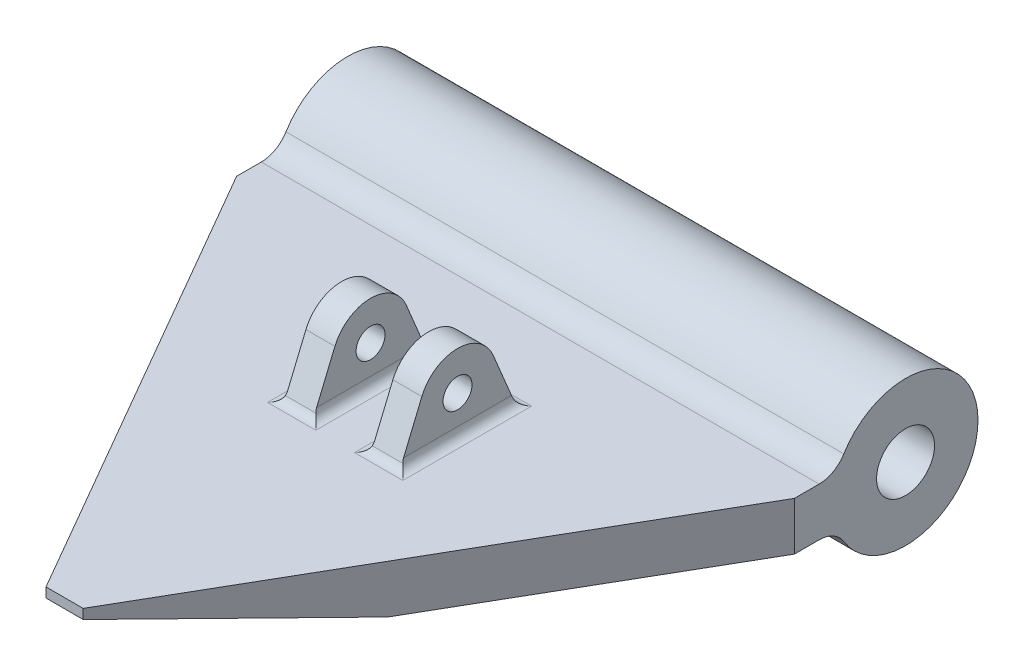
ISO-10303-21;
HEADER;
FILE_DESCRIPTION(('STEP AP214'),'2;1');
FILE_NAME('part.step','',(''),(''),'','','');
FILE_SCHEMA(('AUTOMOTIVE_DESIGN { 1 0 10303 214 1 1 1 1 }'));
ENDSEC;
DATA;
#1=APPLICATION_CONTEXT('core data for automotive mechanical design processes');
#2=APPLICATION_PROTOCOL_DEFINITION('international standard','automotive_design',2000,#1);
#3=PRODUCT_CONTEXT('',#1,'mechanical');
#4=PRODUCT('Part','Part','',(#3));
#5=PRODUCT_RELATED_PRODUCT_CATEGORY('part','',(#4));
#6=PRODUCT_DEFINITION_FORMATION('','',#4);
#7=PRODUCT_DEFINITION_CONTEXT('part definition',#1,'design');
#8=PRODUCT_DEFINITION('design','',#6,#7);
#9=PRODUCT_DEFINITION_SHAPE('','',#8);
#10=(LENGTH_UNIT() NAMED_UNIT(*) SI_UNIT(.MILLI.,.METRE.));
#11=(NAMED_UNIT(*) PLANE_ANGLE_UNIT() SI_UNIT($,.RADIAN.));
#12=(NAMED_UNIT(*) SI_UNIT($,.STERADIAN.) SOLID_ANGLE_UNIT());
#13=UNCERTAINTY_MEASURE_WITH_UNIT(LENGTH_MEASURE(1.E-05),#10,'distance_accuracy_value','');
#14=(GEOMETRIC_REPRESENTATION_CONTEXT(3) GLOBAL_UNCERTAINTY_ASSIGNED_CONTEXT((#13)) GLOBAL_UNIT_ASSIGNED_CONTEXT((#10,
#11,#12)) REPRESENTATION_CONTEXT('',''));
#15=CARTESIAN_POINT('',(0.,0.,0.));
#16=DIRECTION('',(0.,0.,1.));
#17=DIRECTION('',(1.,0.,0.));
#18=AXIS2_PLACEMENT_3D('',#15,#16,#17);
#19=CARTESIAN_POINT('',(0.,5.,0.));
#20=DIRECTION('',(0.,-1.,0.));
#21=DIRECTION('',(0.,0.,-1.));
#22=AXIS2_PLACEMENT_3D('',#19,#20,#21);
#23=PLANE('',#22);
#24=DIRECTION('',(0.,0.,-1.));
#25=VECTOR('',#24,1.);
#26=CARTESIAN_POINT('',(-7.,5.,0.));
#27=LINE('',#26,#25);
#28=CARTESIAN_POINT('',(-7.,5.,-32.3333333333334));
#29=VERTEX_POINT('',#28);
#30=CARTESIAN_POINT('',(-7.,5.,-45.6666666666667));
#31=VERTEX_POINT('',#30);
#32=EDGE_CURVE('E372',#29,#31,#27,.T.);
#33=ORIENTED_EDGE('',*,*,#32,.T.);
#34=DIRECTION('',(1.,0.,0.));
#35=VECTOR('',#34,1.);
#36=CARTESIAN_POINT('',(0.,5.,-45.6666666666667));
#37=LINE('',#36,#35);
#38=CARTESIAN_POINT('',(-2.,5.,-45.6666666666667));
#39=VERTEX_POINT('',#38);
#40=EDGE_CURVE('E378',#31,#39,#37,.T.);
#41=ORIENTED_EDGE('',*,*,#40,.T.);
#42=DIRECTION('',(0.,0.,-1.));
#43=VECTOR('',#42,1.);
#44=CARTESIAN_POINT('',(-2.,5.,-33.));
#45=LINE('',#44,#43);
#46=CARTESIAN_POINT('',(-2.,5.,-32.3333333333334));
#47=VERTEX_POINT('',#46);
#48=EDGE_CURVE('E376',#39,#47,#45,.F.);
#49=ORIENTED_EDGE('',*,*,#48,.T.);
#50=DIRECTION('',(1.,0.,0.));
#51=VECTOR('',#50,1.);
#52=CARTESIAN_POINT('',(0.,5.,-32.3333333333334));
#53=LINE('',#52,#51);
#54=EDGE_CURVE('E374',#47,#29,#53,.F.);
#55=ORIENTED_EDGE('',*,*,#54,.T.);
#56=EDGE_LOOP('',(#33,#41,#49,#55));
#57=FACE_BOUND('',#56,.T.);
#58=DIRECTION('',(0.,0.,-1.));
#59=VECTOR('',#58,1.);
#60=CARTESIAN_POINT('',(2.,5.,-45.));
#61=LINE('',#60,#59);
#62=CARTESIAN_POINT('',(2.,5.,-32.3333333333334));
#63=VERTEX_POINT('',#62);
#64=CARTESIAN_POINT('',(2.,5.,-45.6666666666667));
#65=VERTEX_POINT('',#64);
#66=EDGE_CURVE('E367',#63,#65,#61,.T.);
#67=ORIENTED_EDGE('',*,*,#66,.T.);
#68=DIRECTION('',(-1.,0.,0.));
#69=VECTOR('',#68,1.);
#70=CARTESIAN_POINT('',(6.,5.,-45.6666666666667));
#71=LINE('',#70,#69);
#72=CARTESIAN_POINT('',(7.,5.,-45.6666666666667));
#73=VERTEX_POINT('',#72);
#74=EDGE_CURVE('E369',#65,#73,#71,.F.);
#75=ORIENTED_EDGE('',*,*,#74,.T.);
#76=DIRECTION('',(0.,0.,-1.));
#77=VECTOR('',#76,1.);
#78=CARTESIAN_POINT('',(7.,5.,0.));
#79=LINE('',#78,#77);
#80=CARTESIAN_POINT('',(7.,5.,-32.3333333333334));
#81=VERTEX_POINT('',#80);
#82=EDGE_CURVE('E363',#73,#81,#79,.F.);
#83=ORIENTED_EDGE('',*,*,#82,.T.);
#84=DIRECTION('',(-1.,0.,0.));
#85=VECTOR('',#84,1.);
#86=CARTESIAN_POINT('',(3.,5.,-32.3333333333334));
#87=LINE('',#86,#85);
#88=EDGE_CURVE('E365',#81,#63,#87,.T.);
#89=ORIENTED_EDGE('',*,*,#88,.T.);
#90=EDGE_LOOP('',(#67,#75,#83,#89));
#91=FACE_BOUND('',#90,.T.);
#92=DIRECTION('',(0.5,0.,0.866025403784439));
#93=VECTOR('',#92,1.);
#94=CARTESIAN_POINT('',(-2.0669872981078,5.,-4.58012701892223));
#95=LINE('',#94,#93);
#96=CARTESIAN_POINT('',(-28.8675134594813,5.,-51.));
#97=VERTEX_POINT('',#96);
#98=CARTESIAN_POINT('',(-1.92264973081039,5.,-4.33012701892223));
#99=VERTEX_POINT('',#98);
#100=EDGE_CURVE('E290',#97,#99,#95,.T.);
#101=ORIENTED_EDGE('',*,*,#100,.T.);
#102=DIRECTION('',(-1.,0.,0.));
#103=VECTOR('',#102,1.);
#104=CARTESIAN_POINT('',(-2.49999999999998,5.,-4.33012701892223));
#105=LINE('',#104,#103);
#106=CARTESIAN_POINT('',(1.92264973081039,5.,-4.33012701892223));
#107=VERTEX_POINT('',#106);
#108=EDGE_CURVE('E301',#107,#99,#105,.T.);
#109=ORIENTED_EDGE('',*,*,#108,.F.);
#110=DIRECTION('',(-0.500000000000001,0.,0.866025403784438));
#111=VECTOR('',#110,1.);
#112=CARTESIAN_POINT('',(29.9741761850344,5.,-52.9167960675007));
#113=LINE('',#112,#111);
#114=CARTESIAN_POINT('',(28.8675134594813,5.,-51.));
#115=VERTEX_POINT('',#114);
#116=EDGE_CURVE('E297',#115,#107,#113,.T.);
#117=ORIENTED_EDGE('',*,*,#116,.F.);
#118=DIRECTION('',(0.,0.,-1.));
#119=VECTOR('',#118,1.);
#120=CARTESIAN_POINT('',(28.8675134594813,5.,-70.0000000000001));
#121=LINE('',#120,#119);
#122=CARTESIAN_POINT('',(28.8675134594813,5.,-53.5557280900009));
#123=VERTEX_POINT('',#122);
#124=EDGE_CURVE('E317',#115,#123,#121,.T.);
#125=ORIENTED_EDGE('',*,*,#124,.T.);
#126=DIRECTION('',(1.,0.,0.));
#127=VECTOR('',#126,1.);
#128=CARTESIAN_POINT('',(0.,5.,-53.5557280900009));
#129=LINE('',#128,#127);
#130=CARTESIAN_POINT('',(-28.8675134594813,5.,-53.5557280900008));
#131=VERTEX_POINT('',#130);
#132=EDGE_CURVE('E334',#123,#131,#129,.F.);
#133=ORIENTED_EDGE('',*,*,#132,.T.);
#134=DIRECTION('',(0.,0.,1.));
#135=VECTOR('',#134,1.);
#136=CARTESIAN_POINT('',(-28.8675134594813,5.,-50.));
#137=LINE('',#136,#135);
#138=EDGE_CURVE('E319',#131,#97,#137,.T.);
#139=ORIENTED_EDGE('',*,*,#138,.T.);
#140=EDGE_LOOP('',(#101,#109,#117,#125,#133,#139));
#141=FACE_BOUND('',#140,.T.);
#142=ADVANCED_FACE('F53',(#57,#91,#141),#23,.F.);
#143=CARTESIAN_POINT('',(0.,0.,0.));
#144=DIRECTION('',(0.,-1.,0.));
#145=DIRECTION('',(0.,0.,-1.));
#146=AXIS2_PLACEMENT_3D('',#143,#144,#145);
#147=PLANE('',#146);
#148=DIRECTION('',(0.5,0.,-0.866025403784439));
#149=VECTOR('',#148,1.);
#150=CARTESIAN_POINT('',(2.0669872981078,0.,-4.58012701892223));
#151=LINE('',#150,#149);
#152=CARTESIAN_POINT('',(13.4696551146031,0.,-24.3301270189226));
#153=VERTEX_POINT('',#152);
#154=CARTESIAN_POINT('',(28.8675134594813,0.,-51.));
#155=VERTEX_POINT('',#154);
#156=EDGE_CURVE('E295',#153,#155,#151,.T.);
#157=ORIENTED_EDGE('',*,*,#156,.F.);
#158=DIRECTION('',(-1.,0.,0.));
#159=VECTOR('',#158,1.);
#160=CARTESIAN_POINT('',(-1.92264973081039,0.,-24.3301270189226));
#161=LINE('',#160,#159);
#162=CARTESIAN_POINT('',(-13.4696551146031,0.,-24.3301270189226));
#163=VERTEX_POINT('',#162);
#164=EDGE_CURVE('E352',#153,#163,#161,.T.);
#165=ORIENTED_EDGE('',*,*,#164,.T.);
#166=DIRECTION('',(-0.5,0.,-0.866025403784439));
#167=VECTOR('',#166,1.);
#168=CARTESIAN_POINT('',(-2.0669872981078,0.,-4.58012701892223));
#169=LINE('',#168,#167);
#170=CARTESIAN_POINT('',(-28.8675134594813,0.,-51.));
#171=VERTEX_POINT('',#170);
#172=EDGE_CURVE('E288',#163,#171,#169,.T.);
#173=ORIENTED_EDGE('',*,*,#172,.T.);
#174=DIRECTION('',(0.,0.,1.));
#175=VECTOR('',#174,1.);
#176=CARTESIAN_POINT('',(-28.8675134594813,0.,-50.));
#177=LINE('',#176,#175);
#178=CARTESIAN_POINT('',(-28.8675134594813,0.,-53.5557280900008));
#179=VERTEX_POINT('',#178);
#180=EDGE_CURVE('E320',#179,#171,#177,.T.);
#181=ORIENTED_EDGE('',*,*,#180,.F.);
#182=DIRECTION('',(-1.,0.,0.));
#183=VECTOR('',#182,1.);
#184=CARTESIAN_POINT('',(28.8675134594812,0.,-53.5557280900009));
#185=LINE('',#184,#183);
#186=CARTESIAN_POINT('',(28.8675134594813,0.,-53.5557280900009));
#187=VERTEX_POINT('',#186);
#188=EDGE_CURVE('E331',#179,#187,#185,.F.);
#189=ORIENTED_EDGE('',*,*,#188,.T.);
#190=DIRECTION('',(0.,0.,-1.));
#191=VECTOR('',#190,1.);
#192=CARTESIAN_POINT('',(28.8675134594813,0.,-70.0000000000001));
#193=LINE('',#192,#191);
#194=EDGE_CURVE('E308',#155,#187,#193,.T.);
#195=ORIENTED_EDGE('',*,*,#194,.F.);
#196=EDGE_LOOP('',(#157,#165,#173,#181,#189,#195));
#197=FACE_BOUND('',#196,.T.);
#198=ADVANCED_FACE('F459',(#197),#147,.T.);
#199=CARTESIAN_POINT('',(-2.49999999999998,-6.6143782776615,-4.33012701892223));
#200=DIRECTION('',(0.,0.,-1.));
#201=DIRECTION('',(-1.,0.,0.));
#202=AXIS2_PLACEMENT_3D('',#199,#200,#201);
#203=PLANE('',#202);
#204=DIRECTION('',(0.,1.,0.));
#205=VECTOR('',#204,1.);
#206=CARTESIAN_POINT('',(-1.92264973081039,-6.6143782776615,-4.33012701892223));
#207=LINE('',#206,#205);
#208=CARTESIAN_POINT('',(-1.92264973081039,4.00000000000001,-4.33012701892223));
#209=VERTEX_POINT('',#208);
#210=EDGE_CURVE('E293',#209,#99,#207,.T.);
#211=ORIENTED_EDGE('',*,*,#210,.F.);
#212=DIRECTION('',(1.,0.,0.));
#213=VECTOR('',#212,1.);
#214=CARTESIAN_POINT('',(1.92264973081039,4.00000000000001,-4.33012701892223));
#215=LINE('',#214,#213);
#216=CARTESIAN_POINT('',(1.92264973081039,4.00000000000001,-4.33012701892223));
#217=VERTEX_POINT('',#216);
#218=EDGE_CURVE('E357',#209,#217,#215,.T.);
#219=ORIENTED_EDGE('',*,*,#218,.T.);
#220=DIRECTION('',(0.,-1.,0.));
#221=VECTOR('',#220,1.);
#222=CARTESIAN_POINT('',(1.92264973081039,-6.6143782776615,-4.33012701892223));
#223=LINE('',#222,#221);
#224=EDGE_CURVE('E346',#107,#217,#223,.T.);
#225=ORIENTED_EDGE('',*,*,#224,.F.);
#226=ORIENTED_EDGE('',*,*,#108,.T.);
#227=EDGE_LOOP('',(#211,#219,#225,#226));
#228=FACE_BOUND('',#227,.T.);
#229=ADVANCED_FACE('F464',(#228),#203,.F.);
#230=CARTESIAN_POINT('',(-28.8675134594813,5.,-50.));
#231=DIRECTION('',(1.,0.,0.));
#232=DIRECTION('',(0.,0.,-1.));
#233=AXIS2_PLACEMENT_3D('',#230,#231,#232);
#234=PLANE('',#233);
#235=CARTESIAN_POINT('',(-28.8675134594813,2.5,-62.5));
#236=DIRECTION('',(1.,0.,0.));
#237=DIRECTION('',(0.,0.,-1.));
#238=AXIS2_PLACEMENT_3D('',#235,#236,#237);
#239=CIRCLE('',#238,3.00000000000001);
#240=CARTESIAN_POINT('',(-28.8675134594813,2.5,-65.5));
#241=VERTEX_POINT('',#240);
#242=EDGE_CURVE('E309',#241,#241,#239,.F.);
#243=ORIENTED_EDGE('',*,*,#242,.F.);
#244=EDGE_LOOP('',(#243));
#245=FACE_BOUND('',#244,.T.);
#246=DIRECTION('',(0.,-1.,0.));
#247=VECTOR('',#246,1.);
#248=CARTESIAN_POINT('',(-28.8675134594813,5.,-51.));
#249=LINE('',#248,#247);
#250=EDGE_CURVE('E349',#97,#171,#249,.T.);
#251=ORIENTED_EDGE('',*,*,#250,.F.);
#252=ORIENTED_EDGE('',*,*,#138,.F.);
#253=CARTESIAN_POINT('',(-28.8675134594813,8.,-53.5557280900008));
#254=DIRECTION('',(1.,0.,0.));
#255=DIRECTION('',(0.,0.,-1.));
#256=AXIS2_PLACEMENT_3D('',#253,#254,#255);
#257=CIRCLE('',#256,3.);
#258=CARTESIAN_POINT('',(-28.8675134594813,6.42857142857145,-56.1112343500006));
#259=VERTEX_POINT('',#258);
#260=EDGE_CURVE('E341',#131,#259,#257,.T.);
#261=ORIENTED_EDGE('',*,*,#260,.T.);
#262=CARTESIAN_POINT('',(-28.8675134594813,2.5,-62.5));
#263=DIRECTION('',(1.,0.,0.));
#264=DIRECTION('',(0.,0.,-1.));
#265=AXIS2_PLACEMENT_3D('',#262,#263,#264);
#266=CIRCLE('',#265,7.50000000000001);
#267=CARTESIAN_POINT('',(-28.8675134594813,-1.42857142857145,-56.1112343500006));
#268=VERTEX_POINT('',#267);
#269=EDGE_CURVE('E305',#259,#268,#266,.F.);
#270=ORIENTED_EDGE('',*,*,#269,.T.);
#271=CARTESIAN_POINT('',(-28.8675134594813,-3.,-53.5557280900008));
#272=DIRECTION('',(1.,0.,0.));
#273=DIRECTION('',(0.,0.,-1.));
#274=AXIS2_PLACEMENT_3D('',#271,#272,#273);
#275=CIRCLE('',#274,3.);
#276=EDGE_CURVE('E337',#268,#179,#275,.T.);
#277=ORIENTED_EDGE('',*,*,#276,.T.);
#278=ORIENTED_EDGE('',*,*,#180,.T.);
#279=EDGE_LOOP('',(#251,#252,#261,#270,#277,#278));
#280=FACE_BOUND('',#279,.T.);
#281=ADVANCED_FACE('F471',(#245,#280),#234,.F.);
#282=CARTESIAN_POINT('',(28.8675134594813,5.,-70.0000000000001));
#283=DIRECTION('',(-1.,0.,0.));
#284=DIRECTION('',(0.,0.,1.));
#285=AXIS2_PLACEMENT_3D('',#282,#283,#284);
#286=PLANE('',#285);
#287=CARTESIAN_POINT('',(28.8675134594813,2.5,-62.5000000000001));
#288=DIRECTION('',(1.,0.,0.));
#289=DIRECTION('',(0.,0.,-1.));
#290=AXIS2_PLACEMENT_3D('',#287,#288,#289);
#291=CIRCLE('',#290,3.00000000000001);
#292=CARTESIAN_POINT('',(28.8675134594812,2.5,-65.5000000000001));
#293=VERTEX_POINT('',#292);
#294=EDGE_CURVE('E304',#293,#293,#291,.T.);
#295=ORIENTED_EDGE('',*,*,#294,.F.);
#296=EDGE_LOOP('',(#295));
#297=FACE_BOUND('',#296,.T.);
#298=DIRECTION('',(0.,1.,0.));
#299=VECTOR('',#298,1.);
#300=CARTESIAN_POINT('',(28.8675134594813,5.,-51.));
#301=LINE('',#300,#299);
#302=EDGE_CURVE('E299',#155,#115,#301,.T.);
#303=ORIENTED_EDGE('',*,*,#302,.F.);
#304=ORIENTED_EDGE('',*,*,#194,.T.);
#305=CARTESIAN_POINT('',(28.8675134594813,-3.,-53.5557280900009));
#306=DIRECTION('',(-1.,0.,0.));
#307=DIRECTION('',(0.,0.,1.));
#308=AXIS2_PLACEMENT_3D('',#305,#306,#307);
#309=CIRCLE('',#308,3.);
#310=CARTESIAN_POINT('',(28.8675134594813,-1.42857142857141,-56.1112343500006));
#311=VERTEX_POINT('',#310);
#312=EDGE_CURVE('E339',#187,#311,#309,.T.);
#313=ORIENTED_EDGE('',*,*,#312,.T.);
#314=CARTESIAN_POINT('',(28.8675134594813,2.5,-62.5000000000001));
#315=DIRECTION('',(1.,0.,0.));
#316=DIRECTION('',(0.,0.,-1.));
#317=AXIS2_PLACEMENT_3D('',#314,#315,#316);
#318=CIRCLE('',#317,7.50000000000001);
#319=CARTESIAN_POINT('',(28.8675134594813,6.42857142857141,-56.1112343500007));
#320=VERTEX_POINT('',#319);
#321=EDGE_CURVE('E312',#311,#320,#318,.T.);
#322=ORIENTED_EDGE('',*,*,#321,.T.);
#323=CARTESIAN_POINT('',(28.8675134594813,8.,-53.5557280900009));
#324=DIRECTION('',(-1.,0.,0.));
#325=DIRECTION('',(0.,0.,1.));
#326=AXIS2_PLACEMENT_3D('',#323,#324,#325);
#327=CIRCLE('',#326,3.);
#328=EDGE_CURVE('E343',#320,#123,#327,.T.);
#329=ORIENTED_EDGE('',*,*,#328,.T.);
#330=ORIENTED_EDGE('',*,*,#124,.F.);
#331=EDGE_LOOP('',(#303,#304,#313,#322,#329,#330));
#332=FACE_BOUND('',#331,.T.);
#333=ADVANCED_FACE('F474',(#297,#332),#286,.F.);
#334=CARTESIAN_POINT('',(-50.0807168950777,2.5,-62.5));
#335=DIRECTION('',(1.,0.,0.));
#336=DIRECTION('',(0.,0.,-1.));
#337=AXIS2_PLACEMENT_3D('',#334,#335,#336);
#338=CYLINDRICAL_SURFACE('',#337,7.50000000000001);
#339=ORIENTED_EDGE('',*,*,#321,.F.);
#340=DIRECTION('',(1.,0.,0.));
#341=VECTOR('',#340,1.);
#342=CARTESIAN_POINT('',(-50.0807168950777,-1.42857142857143,-56.1112343500005));
#343=LINE('',#342,#341);
#344=EDGE_CURVE('E328',#311,#268,#343,.F.);
#345=ORIENTED_EDGE('',*,*,#344,.T.);
#346=ORIENTED_EDGE('',*,*,#269,.F.);
#347=DIRECTION('',(1.,0.,0.));
#348=VECTOR('',#347,1.);
#349=CARTESIAN_POINT('',(-50.0807168950777,6.42857142857143,-56.1112343500005));
#350=LINE('',#349,#348);
#351=EDGE_CURVE('E323',#259,#320,#350,.T.);
#352=ORIENTED_EDGE('',*,*,#351,.T.);
#353=EDGE_LOOP('',(#339,#345,#346,#352));
#354=FACE_BOUND('',#353,.T.);
#355=ADVANCED_FACE('F468',(#354),#338,.T.);
#356=CARTESIAN_POINT('',(-50.0807168950777,2.5,-62.5));
#357=DIRECTION('',(1.,0.,0.));
#358=DIRECTION('',(0.,0.,-1.));
#359=AXIS2_PLACEMENT_3D('',#356,#357,#358);
#360=CYLINDRICAL_SURFACE('',#359,3.00000000000001);
#361=CARTESIAN_POINT('',(28.8675134594812,2.5,-65.5000000000001));
#362=CARTESIAN_POINT('',(28.2661069290754,2.5,-65.5000000000001));
#363=CARTESIAN_POINT('',(27.6647003986695,2.5,-65.5000000000001));
#364=CARTESIAN_POINT('',(26.4618873378578,2.5,-65.5000000000001));
#365=CARTESIAN_POINT('',(25.8604808074519,2.5,-65.5000000000001));
#366=CARTESIAN_POINT('',(24.6576677466402,2.5,-65.5000000000001));
#367=CARTESIAN_POINT('',(24.0562612162344,2.5,-65.5000000000001));
#368=CARTESIAN_POINT('',(22.8534481554226,2.5,-65.5000000000001));
#369=CARTESIAN_POINT('',(22.2520416250168,2.5,-65.5000000000001));
#370=CARTESIAN_POINT('',(21.0492285642051,2.5,-65.5000000000001));
#371=CARTESIAN_POINT('',(20.4478220337992,2.5,-65.5000000000001));
#372=CARTESIAN_POINT('',(19.2450089729875,2.5,-65.5000000000001));
#373=CARTESIAN_POINT('',(18.6436024425816,2.5,-65.5000000000001));
#374=CARTESIAN_POINT('',(17.4407893817699,2.5,-65.5000000000001));
#375=CARTESIAN_POINT('',(16.839382851364,2.5,-65.5000000000001));
#376=CARTESIAN_POINT('',(15.6365697905523,2.5,-65.5000000000001));
#377=CARTESIAN_POINT('',(15.0351632601465,2.5,-65.5));
#378=CARTESIAN_POINT('',(13.8323501993347,2.5,-65.5));
#379=CARTESIAN_POINT('',(13.2309436689289,2.5,-65.5));
#380=CARTESIAN_POINT('',(12.0281306081172,2.5,-65.5));
#381=CARTESIAN_POINT('',(11.4267240777113,2.5,-65.5));
#382=CARTESIAN_POINT('',(10.2239110168996,2.5,-65.5));
#383=CARTESIAN_POINT('',(9.62250448649374,2.5,-65.5));
#384=CARTESIAN_POINT('',(8.41969142568202,2.5,-65.5));
#385=CARTESIAN_POINT('',(7.81828489527616,2.5,-65.5));
#386=CARTESIAN_POINT('',(6.61547183446444,2.5,-65.5));
#387=CARTESIAN_POINT('',(6.01406530405858,2.5,-65.5));
#388=CARTESIAN_POINT('',(4.81125224324686,2.5,-65.5));
#389=CARTESIAN_POINT('',(4.209845712841,2.5,-65.5));
#390=CARTESIAN_POINT('',(3.00703265202928,2.5,-65.5));
#391=CARTESIAN_POINT('',(2.40562612162342,2.5,-65.5));
#392=CARTESIAN_POINT('',(1.2028130608117,2.5,-65.5));
#393=CARTESIAN_POINT('',(0.601406530405843,2.5,-65.5));
#394=CARTESIAN_POINT('',(-0.601406530405875,2.5,-65.5));
#395=CARTESIAN_POINT('',(-1.20281306081174,2.5,-65.5));
#396=CARTESIAN_POINT('',(-2.40562612162346,2.5,-65.5));
#397=CARTESIAN_POINT('',(-3.00703265202932,2.5,-65.5));
#398=CARTESIAN_POINT('',(-4.20984571284103,2.5,-65.5));
#399=CARTESIAN_POINT('',(-4.81125224324689,2.5,-65.5));
#400=CARTESIAN_POINT('',(-6.01406530405861,2.5,-65.5));
#401=CARTESIAN_POINT('',(-6.61547183446447,2.5,-65.5));
#402=CARTESIAN_POINT('',(-7.81828489527619,2.5,-65.5));
#403=CARTESIAN_POINT('',(-8.41969142568205,2.5,-65.5));
#404=CARTESIAN_POINT('',(-9.62250448649377,2.5,-65.5));
#405=CARTESIAN_POINT('',(-10.2239110168996,2.5,-65.5));
#406=CARTESIAN_POINT('',(-11.4267240777113,2.5,-65.5));
#407=CARTESIAN_POINT('',(-12.0281306081172,2.5,-65.5));
#408=CARTESIAN_POINT('',(-13.2309436689289,2.5,-65.5));
#409=CARTESIAN_POINT('',(-13.8323501993348,2.5,-65.5));
#410=CARTESIAN_POINT('',(-15.0351632601465,2.5,-65.5));
#411=CARTESIAN_POINT('',(-15.6365697905524,2.5,-65.5));
#412=CARTESIAN_POINT('',(-16.8393828513641,2.5,-65.5));
#413=CARTESIAN_POINT('',(-17.4407893817699,2.5,-65.5));
#414=CARTESIAN_POINT('',(-18.6436024425817,2.5,-65.5));
#415=CARTESIAN_POINT('',(-19.2450089729875,2.5,-65.5));
#416=CARTESIAN_POINT('',(-20.4478220337992,2.5,-65.5));
#417=CARTESIAN_POINT('',(-21.0492285642051,2.5,-65.5));
#418=CARTESIAN_POINT('',(-22.2520416250168,2.5,-65.5));
#419=CARTESIAN_POINT('',(-22.8534481554227,2.5,-65.5));
#420=CARTESIAN_POINT('',(-24.0562612162344,2.5,-65.5));
#421=CARTESIAN_POINT('',(-24.6576677466403,2.5,-65.5));
#422=CARTESIAN_POINT('',(-25.860480807452,2.5,-65.5));
#423=CARTESIAN_POINT('',(-26.4618873378578,2.5,-65.5));
#424=CARTESIAN_POINT('',(-27.6647003986696,2.5,-65.5));
#425=CARTESIAN_POINT('',(-28.2661069290754,2.5,-65.5));
#426=CARTESIAN_POINT('',(-28.8675134594813,2.5,-65.5));
#427=B_SPLINE_CURVE_WITH_KNOTS('',3,(#361,#362,#363,#364,#365,#366,#367,#368,#369,#370,#371,
#372,#373,#374,#375,#376,#377,#378,#379,#380,#381,#382,#383,#384,#385,#386,#387,#388,#389,#390,
#391,#392,#393,#394,#395,#396,#397,#398,#399,#400,#401,#402,#403,#404,#405,#406,#407,#408,#409,
#410,#411,#412,#413,#414,#415,#416,#417,#418,#419,#420,#421,#422,#423,#424,#425,#426),
.UNSPECIFIED.,.F.,.F.,(4,2,2,2,2,2,2,2,2,2,2,2,2,2,2,2,2,2,2,2,2,2,2,2,2,2,2,2,2,2,2,2,4),(0.,
1.80421959121758,3.60843918243516,5.41265877365274,7.21687836487031,9.02109795608789,
10.8253175473055,12.629537138523,14.4337567297406,16.2379763209582,18.0421959121758,
19.8464155033934,21.6506350946109,23.4548546858285,25.2590742770461,27.0632938682637,
28.8675134594812,30.6717330506988,32.4759526419164,34.280172233134,36.0843918243516,
37.8886114155691,39.6928310067867,41.4970505980043,43.3012701892219,45.1054897804395,
46.909709371657,48.7139289628746,50.5181485540922,52.3223681453098,54.1265877365274,
55.9308073277449,57.7350269189625),.UNSPECIFIED.);
#428=EDGE_CURVE('BSEAM483',#293,#241,#427,.T.);
#429=ORIENTED_EDGE('',*,*,#294,.T.);
#430=ORIENTED_EDGE('',*,*,#242,.T.);
#431=ORIENTED_EDGE('',*,*,#428,.T.);
#432=ORIENTED_EDGE('',*,*,#428,.F.);
#433=EDGE_LOOP('',(#429,#431,#430,#432));
#434=FACE_BOUND('',#433,.T.);
#435=ADVANCED_FACE('F483',(#434),#360,.F.);
#436=CARTESIAN_POINT('',(-50.0807168950777,-3.,-53.5557280900008));
#437=DIRECTION('',(1.,0.,0.));
#438=DIRECTION('',(0.,0.,-1.));
#439=AXIS2_PLACEMENT_3D('',#436,#437,#438);
#440=CYLINDRICAL_SURFACE('',#439,3.);
#441=ORIENTED_EDGE('',*,*,#312,.F.);
#442=ORIENTED_EDGE('',*,*,#188,.F.);
#443=ORIENTED_EDGE('',*,*,#276,.F.);
#444=ORIENTED_EDGE('',*,*,#344,.F.);
#445=EDGE_LOOP('',(#441,#442,#443,#444));
#446=FACE_BOUND('',#445,.T.);
#447=ADVANCED_FACE('F479',(#446),#440,.F.);
#448=CARTESIAN_POINT('',(-50.0807168950777,8.,-53.5557280900008));
#449=DIRECTION('',(1.,0.,0.));
#450=DIRECTION('',(0.,0.,-1.));
#451=AXIS2_PLACEMENT_3D('',#448,#449,#450);
#452=CYLINDRICAL_SURFACE('',#451,3.);
#453=ORIENTED_EDGE('',*,*,#328,.F.);
#454=ORIENTED_EDGE('',*,*,#351,.F.);
#455=ORIENTED_EDGE('',*,*,#260,.F.);
#456=ORIENTED_EDGE('',*,*,#132,.F.);
#457=EDGE_LOOP('',(#453,#454,#455,#456));
#458=FACE_BOUND('',#457,.T.);
#459=ADVANCED_FACE('F482',(#458),#452,.F.);
#460=CARTESIAN_POINT('',(29.9741761850344,-3.,-52.9167960675007));
#461=DIRECTION('',(0.866025403784439,0.,0.5));
#462=DIRECTION('',(0.5,0.,-0.866025403784439));
#463=AXIS2_PLACEMENT_3D('',#460,#461,#462);
#464=PLANE('',#463);
#465=ORIENTED_EDGE('',*,*,#224,.T.);
#466=DIRECTION('',(0.492664639082147,-0.17066403719657,-0.853320185982862));
#467=VECTOR('',#466,1.);
#468=CARTESIAN_POINT('',(29.7457023879688,-5.63818816477236,-52.5210678427848));
#469=LINE('',#468,#467);
#470=EDGE_CURVE('E359',#217,#153,#469,.T.);
#471=ORIENTED_EDGE('',*,*,#470,.T.);
#472=ORIENTED_EDGE('',*,*,#156,.T.);
#473=ORIENTED_EDGE('',*,*,#302,.T.);
#474=ORIENTED_EDGE('',*,*,#116,.T.);
#475=EDGE_LOOP('',(#465,#471,#472,#473,#474));
#476=FACE_BOUND('',#475,.T.);
#477=ADVANCED_FACE('F487',(#476),#464,.T.);
#478=CARTESIAN_POINT('',(-29.9741761850344,-3.,-52.9167960675007));
#479=DIRECTION('',(-0.866025403784439,0.,0.5));
#480=DIRECTION('',(-0.5,0.,-0.866025403784439));
#481=AXIS2_PLACEMENT_3D('',#478,#479,#480);
#482=PLANE('',#481);
#483=ORIENTED_EDGE('',*,*,#172,.F.);
#484=DIRECTION('',(0.492664639082147,0.17066403719657,0.853320185982862));
#485=VECTOR('',#484,1.);
#486=CARTESIAN_POINT('',(-29.7457023879688,-5.63818816477236,-52.5210678427848));
#487=LINE('',#486,#485);
#488=EDGE_CURVE('E355',#163,#209,#487,.T.);
#489=ORIENTED_EDGE('',*,*,#488,.T.);
#490=ORIENTED_EDGE('',*,*,#210,.T.);
#491=ORIENTED_EDGE('',*,*,#100,.F.);
#492=ORIENTED_EDGE('',*,*,#250,.T.);
#493=EDGE_LOOP('',(#483,#489,#490,#491,#492));
#494=FACE_BOUND('',#493,.T.);
#495=ADVANCED_FACE('F496',(#494),#482,.T.);
#496=CARTESIAN_POINT('',(0.,0.,-24.3301270189226));
#497=DIRECTION('',(0.,-0.980580675690921,0.196116135138181));
#498=DIRECTION('',(1.,0.,0.));
#499=AXIS2_PLACEMENT_3D('',#496,#497,#498);
#500=PLANE('',#499);
#501=ORIENTED_EDGE('',*,*,#470,.F.);
#502=ORIENTED_EDGE('',*,*,#218,.F.);
#503=ORIENTED_EDGE('',*,*,#488,.F.);
#504=ORIENTED_EDGE('',*,*,#164,.F.);
#505=EDGE_LOOP('',(#501,#502,#503,#504));
#506=FACE_BOUND('',#505,.T.);
#507=ADVANCED_FACE('F490',(#506),#500,.T.);
#508=CARTESIAN_POINT('',(6.,9.,-39.));
#509=DIRECTION('',(1.,0.,0.));
#510=DIRECTION('',(0.,0.,-1.));
#511=AXIS2_PLACEMENT_3D('',#508,#509,#510);
#512=PLANE('',#511);
#513=DIRECTION('',(0.,-0.923076923076923,0.384615384615385));
#514=VECTOR('',#513,1.);
#515=CARTESIAN_POINT('',(6.,10.5384615384615,-35.3076923076923));
#516=LINE('',#515,#514);
#517=CARTESIAN_POINT('',(6.,10.5384615384615,-35.3076923076923));
#518=VERTEX_POINT('',#517);
#519=CARTESIAN_POINT('',(6.,6.,-33.4166666666667));
#520=VERTEX_POINT('',#519);
#521=EDGE_CURVE('E270',#518,#520,#516,.T.);
#522=ORIENTED_EDGE('',*,*,#521,.T.);
#523=DIRECTION('',(0.,0.,-1.));
#524=VECTOR('',#523,1.);
#525=CARTESIAN_POINT('',(6.,6.,-39.));
#526=LINE('',#525,#524);
#527=CARTESIAN_POINT('',(6.,6.,-44.5833333333334));
#528=VERTEX_POINT('',#527);
#529=EDGE_CURVE('E391',#520,#528,#526,.T.);
#530=ORIENTED_EDGE('',*,*,#529,.T.);
#531=DIRECTION('',(0.,0.923076923076923,0.384615384615384));
#532=VECTOR('',#531,1.);
#533=CARTESIAN_POINT('',(6.,5.,-45.));
#534=LINE('',#533,#532);
#535=CARTESIAN_POINT('',(6.,10.5384615384615,-42.6923076923077));
#536=VERTEX_POINT('',#535);
#537=EDGE_CURVE('E274',#528,#536,#534,.T.);
#538=ORIENTED_EDGE('',*,*,#537,.T.);
#539=CARTESIAN_POINT('',(6.,9.,-39.));
#540=DIRECTION('',(1.,0.,0.));
#541=DIRECTION('',(0.,0.,-1.));
#542=AXIS2_PLACEMENT_3D('',#539,#540,#541);
#543=CIRCLE('',#542,4.);
#544=EDGE_CURVE('E267',#536,#518,#543,.T.);
#545=ORIENTED_EDGE('',*,*,#544,.T.);
#546=EDGE_LOOP('',(#522,#530,#538,#545));
#547=FACE_BOUND('',#546,.T.);
#548=CARTESIAN_POINT('',(6.,9.,-39.));
#549=DIRECTION('',(1.,0.,0.));
#550=DIRECTION('',(0.,0.,-1.));
#551=AXIS2_PLACEMENT_3D('',#548,#549,#550);
#552=CIRCLE('',#551,1.5);
#553=CARTESIAN_POINT('',(6.,9.,-40.5));
#554=VERTEX_POINT('',#553);
#555=EDGE_CURVE('E261',#554,#554,#552,.T.);
#556=ORIENTED_EDGE('',*,*,#555,.F.);
#557=EDGE_LOOP('',(#556));
#558=FACE_BOUND('',#557,.T.);
#559=ADVANCED_FACE('F495',(#547,#558),#512,.T.);
#560=CARTESIAN_POINT('',(3.,9.,-39.));
#561=DIRECTION('',(1.,0.,0.));
#562=DIRECTION('',(0.,0.,-1.));
#563=AXIS2_PLACEMENT_3D('',#560,#561,#562);
#564=PLANE('',#563);
#565=DIRECTION('',(0.,0.923076923076923,0.384615384615384));
#566=VECTOR('',#565,1.);
#567=CARTESIAN_POINT('',(3.,5.,-45.));
#568=LINE('',#567,#566);
#569=CARTESIAN_POINT('',(3.,6.,-44.5833333333334));
#570=VERTEX_POINT('',#569);
#571=CARTESIAN_POINT('',(3.,10.5384615384615,-42.6923076923077));
#572=VERTEX_POINT('',#571);
#573=EDGE_CURVE('E271',#570,#572,#568,.T.);
#574=ORIENTED_EDGE('',*,*,#573,.F.);
#575=DIRECTION('',(0.,0.,-1.));
#576=VECTOR('',#575,1.);
#577=CARTESIAN_POINT('',(3.,6.,-33.));
#578=LINE('',#577,#576);
#579=CARTESIAN_POINT('',(3.,6.,-33.4166666666667));
#580=VERTEX_POINT('',#579);
#581=EDGE_CURVE('E385',#570,#580,#578,.F.);
#582=ORIENTED_EDGE('',*,*,#581,.T.);
#583=DIRECTION('',(0.,-0.923076923076923,0.384615384615385));
#584=VECTOR('',#583,1.);
#585=CARTESIAN_POINT('',(3.,10.5384615384615,-35.3076923076923));
#586=LINE('',#585,#584);
#587=CARTESIAN_POINT('',(3.,10.5384615384615,-35.3076923076923));
#588=VERTEX_POINT('',#587);
#589=EDGE_CURVE('E279',#588,#580,#586,.T.);
#590=ORIENTED_EDGE('',*,*,#589,.F.);
#591=CARTESIAN_POINT('',(3.,9.,-39.));
#592=DIRECTION('',(1.,0.,0.));
#593=DIRECTION('',(0.,0.,-1.));
#594=AXIS2_PLACEMENT_3D('',#591,#592,#593);
#595=CIRCLE('',#594,4.);
#596=EDGE_CURVE('E264',#572,#588,#595,.T.);
#597=ORIENTED_EDGE('',*,*,#596,.F.);
#598=EDGE_LOOP('',(#574,#582,#590,#597));
#599=FACE_BOUND('',#598,.T.);
#600=CARTESIAN_POINT('',(3.,9.,-39.));
#601=DIRECTION('',(1.,0.,0.));
#602=DIRECTION('',(0.,0.,-1.));
#603=AXIS2_PLACEMENT_3D('',#600,#601,#602);
#604=CIRCLE('',#603,1.5);
#605=CARTESIAN_POINT('',(3.,9.,-40.5));
#606=VERTEX_POINT('',#605);
#607=EDGE_CURVE('E242',#606,#606,#604,.T.);
#608=ORIENTED_EDGE('',*,*,#607,.T.);
#609=EDGE_LOOP('',(#608));
#610=FACE_BOUND('',#609,.T.);
#611=ADVANCED_FACE('F600',(#599,#610),#564,.F.);
#612=CARTESIAN_POINT('',(6.,9.,-39.));
#613=DIRECTION('',(-1.,0.,0.));
#614=DIRECTION('',(0.,0.,1.));
#615=AXIS2_PLACEMENT_3D('',#612,#613,#614);
#616=CYLINDRICAL_SURFACE('',#615,4.);
#617=ORIENTED_EDGE('',*,*,#596,.T.);
#618=DIRECTION('',(-1.,0.,0.));
#619=VECTOR('',#618,1.);
#620=CARTESIAN_POINT('',(6.,10.5384615384615,-35.3076923076923));
#621=LINE('',#620,#619);
#622=EDGE_CURVE('E285',#518,#588,#621,.T.);
#623=ORIENTED_EDGE('',*,*,#622,.F.);
#624=ORIENTED_EDGE('',*,*,#544,.F.);
#625=DIRECTION('',(-1.,0.,0.));
#626=VECTOR('',#625,1.);
#627=CARTESIAN_POINT('',(6.,10.5384615384615,-42.6923076923077));
#628=LINE('',#627,#626);
#629=EDGE_CURVE('E276',#536,#572,#628,.T.);
#630=ORIENTED_EDGE('',*,*,#629,.T.);
#631=EDGE_LOOP('',(#617,#623,#624,#630));
#632=FACE_BOUND('',#631,.T.);
#633=ADVANCED_FACE('F593',(#632),#616,.T.);
#634=CARTESIAN_POINT('',(6.,10.5384615384615,-35.3076923076923));
#635=DIRECTION('',(0.,-0.384615384615385,-0.923076923076923));
#636=DIRECTION('',(0.,0.923076923076923,-0.384615384615385));
#637=AXIS2_PLACEMENT_3D('',#634,#635,#636);
#638=PLANE('',#637);
#639=CARTESIAN_POINT('',(2.,6.,-33.4166666666667));
#640=DIRECTION('',(0.,-0.384615384615385,-0.923076923076923));
#641=DIRECTION('',(0.,-0.923076923076923,0.384615384615385));
#642=AXIS2_PLACEMENT_3D('',#639,#640,#641);
#643=ELLIPSE('',#642,1.08333333333333,1.);
#644=CARTESIAN_POINT('',(2.92307692307692,5.61538461538461,-33.2564102564103));
#645=VERTEX_POINT('',#644);
#646=EDGE_CURVE('E400',#580,#645,#643,.T.);
#647=ORIENTED_EDGE('',*,*,#646,.T.);
#648=DIRECTION('',(-1.,0.,0.));
#649=VECTOR('',#648,1.);
#650=CARTESIAN_POINT('',(6.,5.61538461538461,-33.2564102564103));
#651=LINE('',#650,#649);
#652=CARTESIAN_POINT('',(6.07692307692308,5.61538461538461,-33.2564102564103));
#653=VERTEX_POINT('',#652);
#654=EDGE_CURVE('E77',#645,#653,#651,.F.);
#655=ORIENTED_EDGE('',*,*,#654,.T.);
#656=CARTESIAN_POINT('',(7.,6.,-33.4166666666667));
#657=DIRECTION('',(0.,-0.384615384615385,-0.923076923076923));
#658=DIRECTION('',(0.,0.923076923076923,-0.384615384615385));
#659=AXIS2_PLACEMENT_3D('',#656,#657,#658);
#660=ELLIPSE('',#659,1.08333333333333,1.);
#661=EDGE_CURVE('E12',#653,#520,#660,.T.);
#662=ORIENTED_EDGE('',*,*,#661,.T.);
#663=ORIENTED_EDGE('',*,*,#521,.F.);
#664=ORIENTED_EDGE('',*,*,#622,.T.);
#665=ORIENTED_EDGE('',*,*,#589,.T.);
#666=EDGE_LOOP('',(#647,#655,#662,#663,#664,#665));
#667=FACE_BOUND('',#666,.T.);
#668=ADVANCED_FACE('F581',(#667),#638,.F.);
#669=CARTESIAN_POINT('',(6.,5.,-45.));
#670=DIRECTION('',(0.,-0.384615384615384,0.923076923076923));
#671=DIRECTION('',(0.,-0.923076923076923,-0.384615384615384));
#672=AXIS2_PLACEMENT_3D('',#669,#670,#671);
#673=PLANE('',#672);
#674=ORIENTED_EDGE('',*,*,#537,.F.);
#675=CARTESIAN_POINT('',(7.,6.,-44.5833333333334));
#676=DIRECTION('',(0.,-0.384615384615384,0.923076923076923));
#677=DIRECTION('',(0.,-0.923076923076923,-0.384615384615384));
#678=AXIS2_PLACEMENT_3D('',#675,#676,#677);
#679=ELLIPSE('',#678,1.08333333333333,1.);
#680=CARTESIAN_POINT('',(6.07692307692308,5.61538461538461,-44.7435897435898));
#681=VERTEX_POINT('',#680);
#682=EDGE_CURVE('E62',#528,#681,#679,.T.);
#683=ORIENTED_EDGE('',*,*,#682,.T.);
#684=DIRECTION('',(-1.,0.,0.));
#685=VECTOR('',#684,1.);
#686=CARTESIAN_POINT('',(3.,5.61538461538461,-44.7435897435898));
#687=LINE('',#686,#685);
#688=CARTESIAN_POINT('',(2.92307692307692,5.61538461538461,-44.7435897435898));
#689=VERTEX_POINT('',#688);
#690=EDGE_CURVE('E361',#681,#689,#687,.T.);
#691=ORIENTED_EDGE('',*,*,#690,.T.);
#692=CARTESIAN_POINT('',(2.,6.,-44.5833333333334));
#693=DIRECTION('',(0.,-0.384615384615384,0.923076923076923));
#694=DIRECTION('',(0.,0.923076923076923,0.384615384615384));
#695=AXIS2_PLACEMENT_3D('',#692,#693,#694);
#696=ELLIPSE('',#695,1.08333333333333,1.);
#697=EDGE_CURVE('E398',#689,#570,#696,.T.);
#698=ORIENTED_EDGE('',*,*,#697,.T.);
#699=ORIENTED_EDGE('',*,*,#573,.T.);
#700=ORIENTED_EDGE('',*,*,#629,.F.);
#701=EDGE_LOOP('',(#674,#683,#691,#698,#699,#700));
#702=FACE_BOUND('',#701,.T.);
#703=ADVANCED_FACE('F575',(#702),#673,.F.);
#704=CARTESIAN_POINT('',(6.,9.,-39.));
#705=DIRECTION('',(-1.,0.,0.));
#706=DIRECTION('',(0.,0.,1.));
#707=AXIS2_PLACEMENT_3D('',#704,#705,#706);
#708=CYLINDRICAL_SURFACE('',#707,1.5);
#709=ORIENTED_EDGE('',*,*,#555,.T.);
#710=EDGE_LOOP('',(#709));
#711=FACE_BOUND('',#710,.T.);
#712=ORIENTED_EDGE('',*,*,#607,.F.);
#713=EDGE_LOOP('',(#712));
#714=FACE_BOUND('',#713,.T.);
#715=ADVANCED_FACE('F580',(#711,#714),#708,.F.);
#716=CARTESIAN_POINT('',(-6.,9.,-39.));
#717=DIRECTION('',(1.,0.,0.));
#718=DIRECTION('',(0.,0.,-1.));
#719=AXIS2_PLACEMENT_3D('',#716,#717,#718);
#720=CYLINDRICAL_SURFACE('',#719,4.);
#721=CARTESIAN_POINT('',(-3.,9.,-39.));
#722=DIRECTION('',(1.,0.,0.));
#723=DIRECTION('',(0.,0.,-1.));
#724=AXIS2_PLACEMENT_3D('',#721,#722,#723);
#725=CIRCLE('',#724,4.);
#726=CARTESIAN_POINT('',(-3.,10.5384615384615,-42.6923076923077));
#727=VERTEX_POINT('',#726);
#728=CARTESIAN_POINT('',(-3.,10.5384615384615,-35.3076923076923));
#729=VERTEX_POINT('',#728);
#730=EDGE_CURVE('E241',#727,#729,#725,.T.);
#731=ORIENTED_EDGE('',*,*,#730,.F.);
#732=DIRECTION('',(1.,0.,0.));
#733=VECTOR('',#732,1.);
#734=CARTESIAN_POINT('',(-6.,10.5384615384615,-42.6923076923077));
#735=LINE('',#734,#733);
#736=CARTESIAN_POINT('',(-6.,10.5384615384615,-42.6923076923077));
#737=VERTEX_POINT('',#736);
#738=EDGE_CURVE('E226',#737,#727,#735,.T.);
#739=ORIENTED_EDGE('',*,*,#738,.F.);
#740=CARTESIAN_POINT('',(-6.,9.,-39.));
#741=DIRECTION('',(1.,0.,0.));
#742=DIRECTION('',(0.,0.,-1.));
#743=AXIS2_PLACEMENT_3D('',#740,#741,#742);
#744=CIRCLE('',#743,4.);
#745=CARTESIAN_POINT('',(-6.,10.5384615384615,-35.3076923076923));
#746=VERTEX_POINT('',#745);
#747=EDGE_CURVE('E234',#737,#746,#744,.T.);
#748=ORIENTED_EDGE('',*,*,#747,.T.);
#749=DIRECTION('',(1.,0.,0.));
#750=VECTOR('',#749,1.);
#751=CARTESIAN_POINT('',(-6.,10.5384615384615,-35.3076923076923));
#752=LINE('',#751,#750);
#753=EDGE_CURVE('E243',#746,#729,#752,.T.);
#754=ORIENTED_EDGE('',*,*,#753,.T.);
#755=EDGE_LOOP('',(#731,#739,#748,#754));
#756=FACE_BOUND('',#755,.T.);
#757=ADVANCED_FACE('F238',(#756),#720,.T.);
#758=CARTESIAN_POINT('',(-6.,5.,-45.));
#759=DIRECTION('',(0.,0.384615384615384,-0.923076923076923));
#760=DIRECTION('',(0.,0.923076923076923,0.384615384615384));
#761=AXIS2_PLACEMENT_3D('',#758,#759,#760);
#762=PLANE('',#761);
#763=DIRECTION('',(0.,0.923076923076923,0.384615384615384));
#764=VECTOR('',#763,1.);
#765=CARTESIAN_POINT('',(-3.,5.,-45.));
#766=LINE('',#765,#764);
#767=CARTESIAN_POINT('',(-3.,6.,-44.5833333333334));
#768=VERTEX_POINT('',#767);
#769=EDGE_CURVE('E250',#768,#727,#766,.T.);
#770=ORIENTED_EDGE('',*,*,#769,.F.);
#771=CARTESIAN_POINT('',(-2.,6.,-44.5833333333334));
#772=DIRECTION('',(0.,0.384615384615384,-0.923076923076923));
#773=DIRECTION('',(0.,0.923076923076923,0.384615384615384));
#774=AXIS2_PLACEMENT_3D('',#771,#772,#773);
#775=ELLIPSE('',#774,1.08333333333333,1.);
#776=CARTESIAN_POINT('',(-2.92307692307692,5.61538461538462,-44.7435897435898));
#777=VERTEX_POINT('',#776);
#778=EDGE_CURVE('E393',#768,#777,#775,.F.);
#779=ORIENTED_EDGE('',*,*,#778,.T.);
#780=DIRECTION('',(1.,0.,0.));
#781=VECTOR('',#780,1.);
#782=CARTESIAN_POINT('',(-6.,5.61538461538462,-44.7435897435898));
#783=LINE('',#782,#781);
#784=CARTESIAN_POINT('',(-6.07692307692308,5.61538461538462,-44.7435897435898));
#785=VERTEX_POINT('',#784);
#786=EDGE_CURVE('E381',#777,#785,#783,.F.);
#787=ORIENTED_EDGE('',*,*,#786,.T.);
#788=CARTESIAN_POINT('',(-7.,6.,-44.5833333333334));
#789=DIRECTION('',(0.,0.384615384615384,-0.923076923076923));
#790=DIRECTION('',(0.,-0.923076923076923,-0.384615384615384));
#791=AXIS2_PLACEMENT_3D('',#788,#789,#790);
#792=ELLIPSE('',#791,1.08333333333333,1.);
#793=CARTESIAN_POINT('',(-6.,6.,-44.5833333333334));
#794=VERTEX_POINT('',#793);
#795=EDGE_CURVE('E229',#785,#794,#792,.F.);
#796=ORIENTED_EDGE('',*,*,#795,.T.);
#797=DIRECTION('',(0.,0.923076923076923,0.384615384615384));
#798=VECTOR('',#797,1.);
#799=CARTESIAN_POINT('',(-6.,5.,-45.));
#800=LINE('',#799,#798);
#801=EDGE_CURVE('E222',#794,#737,#800,.T.);
#802=ORIENTED_EDGE('',*,*,#801,.T.);
#803=ORIENTED_EDGE('',*,*,#738,.T.);
#804=EDGE_LOOP('',(#770,#779,#787,#796,#802,#803));
#805=FACE_BOUND('',#804,.T.);
#806=ADVANCED_FACE('F225',(#805),#762,.T.);
#807=CARTESIAN_POINT('',(-6.,10.5384615384615,-35.3076923076923));
#808=DIRECTION('',(0.,0.384615384615385,0.923076923076923));
#809=DIRECTION('',(0.,-0.923076923076923,0.384615384615385));
#810=AXIS2_PLACEMENT_3D('',#807,#808,#809);
#811=PLANE('',#810);
#812=DIRECTION('',(0.,-0.923076923076923,0.384615384615385));
#813=VECTOR('',#812,1.);
#814=CARTESIAN_POINT('',(-6.,10.5384615384615,-35.3076923076923));
#815=LINE('',#814,#813);
#816=CARTESIAN_POINT('',(-6.,6.,-33.4166666666667));
#817=VERTEX_POINT('',#816);
#818=EDGE_CURVE('E233',#746,#817,#815,.T.);
#819=ORIENTED_EDGE('',*,*,#818,.T.);
#820=CARTESIAN_POINT('',(-7.,6.,-33.4166666666667));
#821=DIRECTION('',(0.,0.384615384615385,0.923076923076923));
#822=DIRECTION('',(0.,0.923076923076923,-0.384615384615385));
#823=AXIS2_PLACEMENT_3D('',#820,#821,#822);
#824=ELLIPSE('',#823,1.08333333333333,1.);
#825=CARTESIAN_POINT('',(-6.07692307692308,5.61538461538462,-33.2564102564103));
#826=VERTEX_POINT('',#825);
#827=EDGE_CURVE('E403',#817,#826,#824,.F.);
#828=ORIENTED_EDGE('',*,*,#827,.T.);
#829=DIRECTION('',(1.,0.,0.));
#830=VECTOR('',#829,1.);
#831=CARTESIAN_POINT('',(-6.,5.61538461538462,-33.2564102564103));
#832=LINE('',#831,#830);
#833=CARTESIAN_POINT('',(-2.92307692307692,5.61538461538462,-33.2564102564103));
#834=VERTEX_POINT('',#833);
#835=EDGE_CURVE('E70',#826,#834,#832,.T.);
#836=ORIENTED_EDGE('',*,*,#835,.T.);
#837=CARTESIAN_POINT('',(-2.,6.,-33.4166666666667));
#838=DIRECTION('',(0.,0.384615384615385,0.923076923076923));
#839=DIRECTION('',(0.,-0.923076923076923,0.384615384615385));
#840=AXIS2_PLACEMENT_3D('',#837,#838,#839);
#841=ELLIPSE('',#840,1.08333333333333,1.);
#842=CARTESIAN_POINT('',(-3.,6.,-33.4166666666667));
#843=VERTEX_POINT('',#842);
#844=EDGE_CURVE('E396',#834,#843,#841,.F.);
#845=ORIENTED_EDGE('',*,*,#844,.T.);
#846=DIRECTION('',(0.,-0.923076923076923,0.384615384615385));
#847=VECTOR('',#846,1.);
#848=CARTESIAN_POINT('',(-3.,10.5384615384615,-35.3076923076923));
#849=LINE('',#848,#847);
#850=EDGE_CURVE('E247',#729,#843,#849,.T.);
#851=ORIENTED_EDGE('',*,*,#850,.F.);
#852=ORIENTED_EDGE('',*,*,#753,.F.);
#853=EDGE_LOOP('',(#819,#828,#836,#845,#851,#852));
#854=FACE_BOUND('',#853,.T.);
#855=ADVANCED_FACE('F447',(#854),#811,.T.);
#856=CARTESIAN_POINT('',(-6.,9.,-39.));
#857=DIRECTION('',(-1.,0.,0.));
#858=DIRECTION('',(0.,0.,-1.));
#859=AXIS2_PLACEMENT_3D('',#856,#857,#858);
#860=PLANE('',#859);
#861=CARTESIAN_POINT('',(-6.,9.,-39.));
#862=DIRECTION('',(1.,0.,0.));
#863=DIRECTION('',(0.,0.,-1.));
#864=AXIS2_PLACEMENT_3D('',#861,#862,#863);
#865=CIRCLE('',#864,1.5);
#866=CARTESIAN_POINT('',(-6.,9.,-40.5));
#867=VERTEX_POINT('',#866);
#868=EDGE_CURVE('E258',#867,#867,#865,.T.);
#869=ORIENTED_EDGE('',*,*,#868,.T.);
#870=EDGE_LOOP('',(#869));
#871=FACE_BOUND('',#870,.T.);
#872=ORIENTED_EDGE('',*,*,#801,.F.);
#873=DIRECTION('',(0.,0.,-1.));
#874=VECTOR('',#873,1.);
#875=CARTESIAN_POINT('',(-6.,6.,-39.));
#876=LINE('',#875,#874);
#877=EDGE_CURVE('E389',#794,#817,#876,.F.);
#878=ORIENTED_EDGE('',*,*,#877,.T.);
#879=ORIENTED_EDGE('',*,*,#818,.F.);
#880=ORIENTED_EDGE('',*,*,#747,.F.);
#881=EDGE_LOOP('',(#872,#878,#879,#880));
#882=FACE_BOUND('',#881,.T.);
#883=ADVANCED_FACE('F245',(#871,#882),#860,.T.);
#884=CARTESIAN_POINT('',(-3.,9.,-39.));
#885=DIRECTION('',(-1.,0.,0.));
#886=DIRECTION('',(0.,0.,-1.));
#887=AXIS2_PLACEMENT_3D('',#884,#885,#886);
#888=PLANE('',#887);
#889=CARTESIAN_POINT('',(-3.,9.,-39.));
#890=DIRECTION('',(1.,0.,0.));
#891=DIRECTION('',(0.,0.,-1.));
#892=AXIS2_PLACEMENT_3D('',#889,#890,#891);
#893=CIRCLE('',#892,1.5);
#894=CARTESIAN_POINT('',(-3.,9.,-40.5));
#895=VERTEX_POINT('',#894);
#896=EDGE_CURVE('E253',#895,#895,#893,.T.);
#897=ORIENTED_EDGE('',*,*,#896,.F.);
#898=EDGE_LOOP('',(#897));
#899=FACE_BOUND('',#898,.T.);
#900=ORIENTED_EDGE('',*,*,#850,.T.);
#901=DIRECTION('',(0.,0.,-1.));
#902=VECTOR('',#901,1.);
#903=CARTESIAN_POINT('',(-3.,6.,-45.));
#904=LINE('',#903,#902);
#905=EDGE_CURVE('E383',#843,#768,#904,.T.);
#906=ORIENTED_EDGE('',*,*,#905,.T.);
#907=ORIENTED_EDGE('',*,*,#769,.T.);
#908=ORIENTED_EDGE('',*,*,#730,.T.);
#909=EDGE_LOOP('',(#900,#906,#907,#908));
#910=FACE_BOUND('',#909,.T.);
#911=ADVANCED_FACE('F444',(#899,#910),#888,.F.);
#912=CARTESIAN_POINT('',(-6.,9.,-39.));
#913=DIRECTION('',(1.,0.,0.));
#914=DIRECTION('',(0.,0.,-1.));
#915=AXIS2_PLACEMENT_3D('',#912,#913,#914);
#916=CYLINDRICAL_SURFACE('',#915,1.5);
#917=ORIENTED_EDGE('',*,*,#868,.F.);
#918=EDGE_LOOP('',(#917));
#919=FACE_BOUND('',#918,.T.);
#920=ORIENTED_EDGE('',*,*,#896,.T.);
#921=EDGE_LOOP('',(#920));
#922=FACE_BOUND('',#921,.T.);
#923=ADVANCED_FACE('F513',(#919,#922),#916,.F.);
#924=CARTESIAN_POINT('',(0.,6.,-32.3333333333334));
#925=DIRECTION('',(1.,0.,0.));
#926=DIRECTION('',(0.,0.,-1.));
#927=AXIS2_PLACEMENT_3D('',#924,#925,#926);
#928=CYLINDRICAL_SURFACE('',#927,1.);
#929=CARTESIAN_POINT('',(2.,6.,-32.3333333333334));
#930=DIRECTION('',(0.707106781186547,0.,0.707106781186547));
#931=DIRECTION('',(0.707106781186547,0.,-0.707106781186547));
#932=AXIS2_PLACEMENT_3D('',#929,#930,#931);
#933=ELLIPSE('',#932,1.41421356237309,1.);
#934=EDGE_CURVE('E412',#63,#645,#933,.T.);
#935=ORIENTED_EDGE('',*,*,#934,.F.);
#936=ORIENTED_EDGE('',*,*,#88,.F.);
#937=CARTESIAN_POINT('',(7.,6.,-32.3333333333334));
#938=DIRECTION('',(0.707106781186547,0.,-0.707106781186547));
#939=DIRECTION('',(-0.707106781186547,0.,-0.707106781186547));
#940=AXIS2_PLACEMENT_3D('',#937,#938,#939);
#941=ELLIPSE('',#940,1.41421356237309,1.);
#942=EDGE_CURVE('E415',#653,#81,#941,.F.);
#943=ORIENTED_EDGE('',*,*,#942,.F.);
#944=ORIENTED_EDGE('',*,*,#654,.F.);
#945=EDGE_LOOP('',(#935,#936,#943,#944));
#946=FACE_BOUND('',#945,.T.);
#947=ADVANCED_FACE('F509',(#946),#928,.F.);
#948=CARTESIAN_POINT('',(7.,6.,-39.));
#949=DIRECTION('',(0.,0.,-1.));
#950=DIRECTION('',(-1.,0.,0.));
#951=AXIS2_PLACEMENT_3D('',#948,#949,#950);
#952=CYLINDRICAL_SURFACE('',#951,1.);
#953=ORIENTED_EDGE('',*,*,#942,.T.);
#954=ORIENTED_EDGE('',*,*,#82,.F.);
#955=CARTESIAN_POINT('',(7.,6.,-45.6666666666667));
#956=DIRECTION('',(-0.707106781186547,0.,-0.707106781186548));
#957=DIRECTION('',(0.707106781186547,0.,-0.707106781186548));
#958=AXIS2_PLACEMENT_3D('',#955,#956,#957);
#959=ELLIPSE('',#958,1.41421356237309,1.);
#960=EDGE_CURVE('E410',#681,#73,#959,.F.);
#961=ORIENTED_EDGE('',*,*,#960,.F.);
#962=ORIENTED_EDGE('',*,*,#682,.F.);
#963=ORIENTED_EDGE('',*,*,#529,.F.);
#964=ORIENTED_EDGE('',*,*,#661,.F.);
#965=EDGE_LOOP('',(#953,#954,#961,#962,#963,#964));
#966=FACE_BOUND('',#965,.T.);
#967=ADVANCED_FACE('F505',(#966),#952,.F.);
#968=CARTESIAN_POINT('',(2.,6.,0.));
#969=DIRECTION('',(0.,0.,1.));
#970=DIRECTION('',(1.,0.,0.));
#971=AXIS2_PLACEMENT_3D('',#968,#969,#970);
#972=CYLINDRICAL_SURFACE('',#971,1.);
#973=ORIENTED_EDGE('',*,*,#581,.F.);
#974=ORIENTED_EDGE('',*,*,#697,.F.);
#975=CARTESIAN_POINT('',(2.,6.,-45.6666666666667));
#976=DIRECTION('',(-0.707106781186547,0.,0.707106781186548));
#977=DIRECTION('',(0.707106781186547,0.,0.707106781186548));
#978=AXIS2_PLACEMENT_3D('',#975,#976,#977);
#979=ELLIPSE('',#978,1.41421356237309,1.);
#980=EDGE_CURVE('E407',#65,#689,#979,.T.);
#981=ORIENTED_EDGE('',*,*,#980,.F.);
#982=ORIENTED_EDGE('',*,*,#66,.F.);
#983=ORIENTED_EDGE('',*,*,#934,.T.);
#984=ORIENTED_EDGE('',*,*,#646,.F.);
#985=EDGE_LOOP('',(#973,#974,#981,#982,#983,#984));
#986=FACE_BOUND('',#985,.T.);
#987=ADVANCED_FACE('F501',(#986),#972,.F.);
#988=CARTESIAN_POINT('',(6.,6.,-45.6666666666667));
#989=DIRECTION('',(1.,0.,0.));
#990=DIRECTION('',(0.,0.,-1.));
#991=AXIS2_PLACEMENT_3D('',#988,#989,#990);
#992=CYLINDRICAL_SURFACE('',#991,1.);
#993=ORIENTED_EDGE('',*,*,#960,.T.);
#994=ORIENTED_EDGE('',*,*,#74,.F.);
#995=ORIENTED_EDGE('',*,*,#980,.T.);
#996=ORIENTED_EDGE('',*,*,#690,.F.);
#997=EDGE_LOOP('',(#993,#994,#995,#996));
#998=FACE_BOUND('',#997,.T.);
#999=ADVANCED_FACE('F498',(#998),#992,.F.);
#1000=CARTESIAN_POINT('',(-6.,6.,-32.3333333333334));
#1001=DIRECTION('',(1.,0.,0.));
#1002=DIRECTION('',(0.,0.,-1.));
#1003=AXIS2_PLACEMENT_3D('',#1000,#1001,#1002);
#1004=CYLINDRICAL_SURFACE('',#1003,1.);
#1005=ORIENTED_EDGE('',*,*,#835,.F.);
#1006=CARTESIAN_POINT('',(-7.,6.,-32.3333333333334));
#1007=DIRECTION('',(-0.707106781186547,0.,-0.707106781186547));
#1008=DIRECTION('',(0.707106781186547,0.,-0.707106781186547));
#1009=AXIS2_PLACEMENT_3D('',#1006,#1007,#1008);
#1010=ELLIPSE('',#1009,1.41421356237309,1.);
#1011=EDGE_CURVE('E57',#29,#826,#1010,.F.);
#1012=ORIENTED_EDGE('',*,*,#1011,.F.);
#1013=ORIENTED_EDGE('',*,*,#54,.F.);
#1014=CARTESIAN_POINT('',(-2.,6.,-32.3333333333334));
#1015=DIRECTION('',(0.707106781186547,0.,-0.707106781186547));
#1016=DIRECTION('',(0.707106781186547,0.,0.707106781186547));
#1017=AXIS2_PLACEMENT_3D('',#1014,#1015,#1016);
#1018=ELLIPSE('',#1017,1.41421356237309,1.);
#1019=EDGE_CURVE('E422',#834,#47,#1018,.F.);
#1020=ORIENTED_EDGE('',*,*,#1019,.F.);
#1021=EDGE_LOOP('',(#1005,#1012,#1013,#1020));
#1022=FACE_BOUND('',#1021,.T.);
#1023=ADVANCED_FACE('F55',(#1022),#1004,.F.);
#1024=CARTESIAN_POINT('',(-7.,6.,0.));
#1025=DIRECTION('',(0.,0.,-1.));
#1026=DIRECTION('',(-1.,0.,0.));
#1027=AXIS2_PLACEMENT_3D('',#1024,#1025,#1026);
#1028=CYLINDRICAL_SURFACE('',#1027,1.);
#1029=ORIENTED_EDGE('',*,*,#877,.F.);
#1030=ORIENTED_EDGE('',*,*,#795,.F.);
#1031=CARTESIAN_POINT('',(-7.,6.,-45.6666666666667));
#1032=DIRECTION('',(0.707106781186547,0.,-0.707106781186548));
#1033=DIRECTION('',(-0.707106781186547,0.,-0.707106781186548));
#1034=AXIS2_PLACEMENT_3D('',#1031,#1032,#1033);
#1035=ELLIPSE('',#1034,1.41421356237309,1.);
#1036=EDGE_CURVE('E420',#31,#785,#1035,.F.);
#1037=ORIENTED_EDGE('',*,*,#1036,.F.);
#1038=ORIENTED_EDGE('',*,*,#32,.F.);
#1039=ORIENTED_EDGE('',*,*,#1011,.T.);
#1040=ORIENTED_EDGE('',*,*,#827,.F.);
#1041=EDGE_LOOP('',(#1029,#1030,#1037,#1038,#1039,#1040));
#1042=FACE_BOUND('',#1041,.T.);
#1043=ADVANCED_FACE('F431',(#1042),#1028,.F.);
#1044=CARTESIAN_POINT('',(-2.,6.,-39.));
#1045=DIRECTION('',(0.,0.,1.));
#1046=DIRECTION('',(1.,0.,0.));
#1047=AXIS2_PLACEMENT_3D('',#1044,#1045,#1046);
#1048=CYLINDRICAL_SURFACE('',#1047,1.);
#1049=ORIENTED_EDGE('',*,*,#1019,.T.);
#1050=ORIENTED_EDGE('',*,*,#48,.F.);
#1051=CARTESIAN_POINT('',(-2.,6.,-45.6666666666667));
#1052=DIRECTION('',(0.707106781186547,0.,0.707106781186548));
#1053=DIRECTION('',(-0.707106781186547,0.,0.707106781186548));
#1054=AXIS2_PLACEMENT_3D('',#1051,#1052,#1053);
#1055=ELLIPSE('',#1054,1.41421356237309,1.);
#1056=EDGE_CURVE('E418',#777,#39,#1055,.T.);
#1057=ORIENTED_EDGE('',*,*,#1056,.F.);
#1058=ORIENTED_EDGE('',*,*,#778,.F.);
#1059=ORIENTED_EDGE('',*,*,#905,.F.);
#1060=ORIENTED_EDGE('',*,*,#844,.F.);
#1061=EDGE_LOOP('',(#1049,#1050,#1057,#1058,#1059,#1060));
#1062=FACE_BOUND('',#1061,.T.);
#1063=ADVANCED_FACE('F438',(#1062),#1048,.F.);
#1064=CARTESIAN_POINT('',(0.,6.,-45.6666666666667));
#1065=DIRECTION('',(1.,0.,0.));
#1066=DIRECTION('',(0.,0.,-1.));
#1067=AXIS2_PLACEMENT_3D('',#1064,#1065,#1066);
#1068=CYLINDRICAL_SURFACE('',#1067,1.);
#1069=ORIENTED_EDGE('',*,*,#1036,.T.);
#1070=ORIENTED_EDGE('',*,*,#786,.F.);
#1071=ORIENTED_EDGE('',*,*,#1056,.T.);
#1072=ORIENTED_EDGE('',*,*,#40,.F.);
#1073=EDGE_LOOP('',(#1069,#1070,#1071,#1072));
#1074=FACE_BOUND('',#1073,.T.);
#1075=ADVANCED_FACE('F442',(#1074),#1068,.F.);
#1076=CLOSED_SHELL('',(#142,#198,#229,#281,#333,#355,#435,#447,#459,#477,#495,#507,#559,#611,
#633,#668,#703,#715,#757,#806,#855,#883,#911,#923,#947,#967,#987,#999,#1023,#1043,#1063,#1075));
#1077=MANIFOLD_SOLID_BREP('B2',#1076);
#1078=ADVANCED_BREP_SHAPE_REPRESENTATION('',(#18,#1077),#14);
#1079=SHAPE_DEFINITION_REPRESENTATION(#9,#1078);
ENDSEC;
END-ISO-10303-21;
